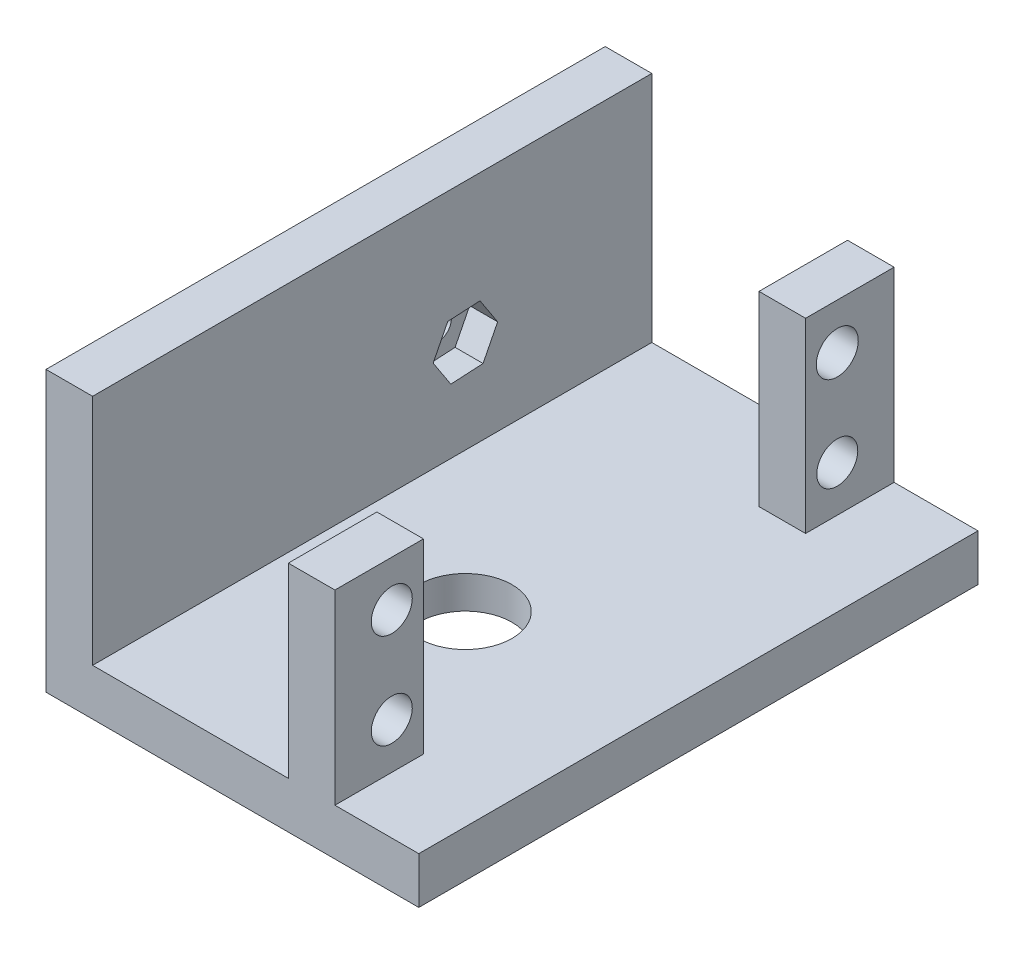
ISO-10303-21;
HEADER;
FILE_DESCRIPTION(('STEP AP214'),'2;1');
FILE_NAME('part.step','',(''),(''),'','','');
FILE_SCHEMA(('AUTOMOTIVE_DESIGN { 1 0 10303 214 1 1 1 1 }'));
ENDSEC;
DATA;
#1=APPLICATION_CONTEXT('core data for automotive mechanical design processes');
#2=APPLICATION_PROTOCOL_DEFINITION('international standard','automotive_design',2000,#1);
#3=PRODUCT_CONTEXT('',#1,'mechanical');
#4=PRODUCT('Part','Part','',(#3));
#5=PRODUCT_RELATED_PRODUCT_CATEGORY('part','',(#4));
#6=PRODUCT_DEFINITION_FORMATION('','',#4);
#7=PRODUCT_DEFINITION_CONTEXT('part definition',#1,'design');
#8=PRODUCT_DEFINITION('design','',#6,#7);
#9=PRODUCT_DEFINITION_SHAPE('','',#8);
#10=(LENGTH_UNIT() NAMED_UNIT(*) SI_UNIT(.MILLI.,.METRE.));
#11=(NAMED_UNIT(*) PLANE_ANGLE_UNIT() SI_UNIT($,.RADIAN.));
#12=(NAMED_UNIT(*) SI_UNIT($,.STERADIAN.) SOLID_ANGLE_UNIT());
#13=UNCERTAINTY_MEASURE_WITH_UNIT(LENGTH_MEASURE(1.E-05),#10,'distance_accuracy_value','');
#14=(GEOMETRIC_REPRESENTATION_CONTEXT(3) GLOBAL_UNCERTAINTY_ASSIGNED_CONTEXT((#13)) GLOBAL_UNIT_ASSIGNED_CONTEXT((#10,
#11,#12)) REPRESENTATION_CONTEXT('',''));
#15=CARTESIAN_POINT('',(0.,0.,0.));
#16=DIRECTION('',(0.,0.,1.));
#17=DIRECTION('',(1.,0.,0.));
#18=AXIS2_PLACEMENT_3D('',#15,#16,#17);
#19=CARTESIAN_POINT('',(10.,15.0000000000001,20.));
#20=DIRECTION('',(-1.,0.,0.));
#21=DIRECTION('',(0.,-1.,0.));
#22=AXIS2_PLACEMENT_3D('',#19,#20,#21);
#23=CYLINDRICAL_SURFACE('',#22,1.5);
#24=CARTESIAN_POINT('',(0.,15.0000000000001,20.));
#25=DIRECTION('',(-1.,0.,0.));
#26=DIRECTION('',(0.,-1.,0.));
#27=AXIS2_PLACEMENT_3D('',#24,#25,#26);
#28=CIRCLE('',#27,1.5);
#29=CARTESIAN_POINT('',(0.,13.5000000000001,20.));
#30=VERTEX_POINT('',#29);
#31=EDGE_CURVE('E227',#30,#30,#28,.T.);
#32=ORIENTED_EDGE('',*,*,#31,.T.);
#33=EDGE_LOOP('',(#32));
#34=FACE_BOUND('',#33,.T.);
#35=CARTESIAN_POINT('',(2.,15.0000000000001,20.));
#36=DIRECTION('',(1.,0.,0.));
#37=DIRECTION('',(0.,0.,-1.));
#38=AXIS2_PLACEMENT_3D('',#35,#36,#37);
#39=CIRCLE('',#38,1.5);
#40=CARTESIAN_POINT('',(2.,15.0000000000001,18.5));
#41=VERTEX_POINT('',#40);
#42=EDGE_CURVE('E37',#41,#41,#39,.F.);
#43=ORIENTED_EDGE('',*,*,#42,.F.);
#44=EDGE_LOOP('',(#43));
#45=FACE_BOUND('',#44,.T.);
#46=ADVANCED_FACE('F33',(#34,#45),#23,.F.);
#47=CARTESIAN_POINT('',(31.,25.,60.));
#48=DIRECTION('',(-1.,0.,0.));
#49=DIRECTION('',(0.,-1.,0.));
#50=AXIS2_PLACEMENT_3D('',#47,#48,#49);
#51=PLANE('',#50);
#52=CARTESIAN_POINT('',(31.,20.1,6.09999999999999));
#53=DIRECTION('',(1.,0.,0.));
#54=DIRECTION('',(0.,1.,0.));
#55=AXIS2_PLACEMENT_3D('',#52,#53,#54);
#56=CIRCLE('',#55,2.25352460703334);
#57=CARTESIAN_POINT('',(31.,22.3535246070334,6.09999999999999));
#58=VERTEX_POINT('',#57);
#59=EDGE_CURVE('E230',#58,#58,#56,.T.);
#60=ORIENTED_EDGE('',*,*,#59,.F.);
#61=EDGE_LOOP('',(#60));
#62=FACE_BOUND('',#61,.T.);
#63=CARTESIAN_POINT('',(31.,9.90000000000002,6.09999999999999));
#64=DIRECTION('',(1.,0.,0.));
#65=DIRECTION('',(0.,1.,0.));
#66=AXIS2_PLACEMENT_3D('',#63,#64,#65);
#67=CIRCLE('',#66,2.20000000000001);
#68=CARTESIAN_POINT('',(31.,12.1,6.09999999999999));
#69=VERTEX_POINT('',#68);
#70=EDGE_CURVE('E234',#69,#69,#67,.T.);
#71=ORIENTED_EDGE('',*,*,#70,.F.);
#72=EDGE_LOOP('',(#71));
#73=FACE_BOUND('',#72,.T.);
#74=DIRECTION('',(0.,0.,-1.));
#75=VECTOR('',#74,1.);
#76=CARTESIAN_POINT('',(31.,25.,60.));
#77=LINE('',#76,#75);
#78=CARTESIAN_POINT('',(31.,25.,9.5));
#79=VERTEX_POINT('',#78);
#80=CARTESIAN_POINT('',(31.,25.,0.));
#81=VERTEX_POINT('',#80);
#82=EDGE_CURVE('E339',#79,#81,#77,.T.);
#83=ORIENTED_EDGE('',*,*,#82,.F.);
#84=DIRECTION('',(0.,1.,0.));
#85=VECTOR('',#84,1.);
#86=CARTESIAN_POINT('',(31.,-36.3037528561268,9.5));
#87=LINE('',#86,#85);
#88=CARTESIAN_POINT('',(31.,5.,9.5));
#89=VERTEX_POINT('',#88);
#90=EDGE_CURVE('E271',#89,#79,#87,.T.);
#91=ORIENTED_EDGE('',*,*,#90,.F.);
#92=DIRECTION('',(0.,0.,-1.));
#93=VECTOR('',#92,1.);
#94=CARTESIAN_POINT('',(31.,5.,60.));
#95=LINE('',#94,#93);
#96=CARTESIAN_POINT('',(31.,5.,0.));
#97=VERTEX_POINT('',#96);
#98=EDGE_CURVE('E343',#89,#97,#95,.T.);
#99=ORIENTED_EDGE('',*,*,#98,.T.);
#100=DIRECTION('',(0.,1.,0.));
#101=VECTOR('',#100,1.);
#102=CARTESIAN_POINT('',(31.,25.,0.));
#103=LINE('',#102,#101);
#104=EDGE_CURVE('E309',#97,#81,#103,.T.);
#105=ORIENTED_EDGE('',*,*,#104,.T.);
#106=EDGE_LOOP('',(#83,#91,#99,#105));
#107=FACE_BOUND('',#106,.T.);
#108=ADVANCED_FACE('F378',(#62,#73,#107),#51,.F.);
#109=CARTESIAN_POINT('',(26.,25.,60.));
#110=DIRECTION('',(0.,-1.,0.));
#111=DIRECTION('',(0.,0.,-1.));
#112=AXIS2_PLACEMENT_3D('',#109,#110,#111);
#113=PLANE('',#112);
#114=DIRECTION('',(0.,0.,-1.));
#115=VECTOR('',#114,1.);
#116=CARTESIAN_POINT('',(26.,25.,60.));
#117=LINE('',#116,#115);
#118=CARTESIAN_POINT('',(26.,25.,9.5));
#119=VERTEX_POINT('',#118);
#120=CARTESIAN_POINT('',(26.,25.,0.));
#121=VERTEX_POINT('',#120);
#122=EDGE_CURVE('E335',#119,#121,#117,.T.);
#123=ORIENTED_EDGE('',*,*,#122,.F.);
#124=DIRECTION('',(-1.,0.,0.));
#125=VECTOR('',#124,1.);
#126=CARTESIAN_POINT('',(31.,25.,9.5));
#127=LINE('',#126,#125);
#128=EDGE_CURVE('E256',#79,#119,#127,.T.);
#129=ORIENTED_EDGE('',*,*,#128,.F.);
#130=ORIENTED_EDGE('',*,*,#82,.T.);
#131=DIRECTION('',(-1.,0.,0.));
#132=VECTOR('',#131,1.);
#133=CARTESIAN_POINT('',(26.,25.,0.));
#134=LINE('',#133,#132);
#135=EDGE_CURVE('E312',#81,#121,#134,.T.);
#136=ORIENTED_EDGE('',*,*,#135,.T.);
#137=EDGE_LOOP('',(#123,#129,#130,#136));
#138=FACE_BOUND('',#137,.T.);
#139=ADVANCED_FACE('F383',(#138),#113,.F.);
#140=CARTESIAN_POINT('',(26.,5.,60.));
#141=DIRECTION('',(1.,0.,0.));
#142=DIRECTION('',(0.,0.,-1.));
#143=AXIS2_PLACEMENT_3D('',#140,#141,#142);
#144=PLANE('',#143);
#145=CARTESIAN_POINT('',(26.,20.1,6.09999999999999));
#146=DIRECTION('',(1.,0.,0.));
#147=DIRECTION('',(0.,0.,-1.));
#148=AXIS2_PLACEMENT_3D('',#145,#146,#147);
#149=CIRCLE('',#148,2.25352460703334);
#150=CARTESIAN_POINT('',(26.,20.1,3.84647539296665));
#151=VERTEX_POINT('',#150);
#152=EDGE_CURVE('E233',#151,#151,#149,.T.);
#153=ORIENTED_EDGE('',*,*,#152,.T.);
#154=EDGE_LOOP('',(#153));
#155=FACE_BOUND('',#154,.T.);
#156=CARTESIAN_POINT('',(26.,9.90000000000002,6.09999999999999));
#157=DIRECTION('',(1.,0.,0.));
#158=DIRECTION('',(0.,0.,-1.));
#159=AXIS2_PLACEMENT_3D('',#156,#157,#158);
#160=CIRCLE('',#159,2.20000000000001);
#161=CARTESIAN_POINT('',(26.,9.90000000000002,3.89999999999999));
#162=VERTEX_POINT('',#161);
#163=EDGE_CURVE('E237',#162,#162,#160,.T.);
#164=ORIENTED_EDGE('',*,*,#163,.T.);
#165=EDGE_LOOP('',(#164));
#166=FACE_BOUND('',#165,.T.);
#167=DIRECTION('',(0.,0.,-1.));
#168=VECTOR('',#167,1.);
#169=CARTESIAN_POINT('',(26.,5.,60.));
#170=LINE('',#169,#168);
#171=CARTESIAN_POINT('',(26.,5.,9.5));
#172=VERTEX_POINT('',#171);
#173=CARTESIAN_POINT('',(26.,5.,0.));
#174=VERTEX_POINT('',#173);
#175=EDGE_CURVE('E331',#172,#174,#170,.T.);
#176=ORIENTED_EDGE('',*,*,#175,.F.);
#177=DIRECTION('',(0.,1.,0.));
#178=VECTOR('',#177,1.);
#179=CARTESIAN_POINT('',(26.,-36.3037528561268,9.5));
#180=LINE('',#179,#178);
#181=EDGE_CURVE('E263',#172,#119,#180,.T.);
#182=ORIENTED_EDGE('',*,*,#181,.T.);
#183=ORIENTED_EDGE('',*,*,#122,.T.);
#184=DIRECTION('',(0.,-1.,0.));
#185=VECTOR('',#184,1.);
#186=CARTESIAN_POINT('',(26.,5.,0.));
#187=LINE('',#186,#185);
#188=EDGE_CURVE('E315',#121,#174,#187,.T.);
#189=ORIENTED_EDGE('',*,*,#188,.T.);
#190=EDGE_LOOP('',(#176,#182,#183,#189));
#191=FACE_BOUND('',#190,.T.);
#192=ADVANCED_FACE('F360',(#155,#166,#191),#144,.F.);
#193=CARTESIAN_POINT('',(0.,30.,60.));
#194=DIRECTION('',(1.,0.,0.));
#195=DIRECTION('',(0.,1.,0.));
#196=AXIS2_PLACEMENT_3D('',#193,#194,#195);
#197=PLANE('',#196);
#198=ORIENTED_EDGE('',*,*,#31,.F.);
#199=EDGE_LOOP('',(#198));
#200=FACE_BOUND('',#199,.T.);
#201=DIRECTION('',(0.,-1.,0.));
#202=VECTOR('',#201,1.);
#203=CARTESIAN_POINT('',(0.,30.,0.));
#204=LINE('',#203,#202);
#205=CARTESIAN_POINT('',(0.,30.,0.));
#206=VERTEX_POINT('',#205);
#207=CARTESIAN_POINT('',(0.,0.,0.));
#208=VERTEX_POINT('',#207);
#209=EDGE_CURVE('E276',#206,#208,#204,.T.);
#210=ORIENTED_EDGE('',*,*,#209,.T.);
#211=DIRECTION('',(0.,0.,-1.));
#212=VECTOR('',#211,1.);
#213=CARTESIAN_POINT('',(0.,0.,60.));
#214=LINE('',#213,#212);
#215=CARTESIAN_POINT('',(0.,0.,60.));
#216=VERTEX_POINT('',#215);
#217=EDGE_CURVE('E11',#216,#208,#214,.T.);
#218=ORIENTED_EDGE('',*,*,#217,.F.);
#219=DIRECTION('',(0.,-1.,0.));
#220=VECTOR('',#219,1.);
#221=CARTESIAN_POINT('',(0.,30.,60.));
#222=LINE('',#221,#220);
#223=CARTESIAN_POINT('',(0.,30.,60.));
#224=VERTEX_POINT('',#223);
#225=EDGE_CURVE('E277',#224,#216,#222,.T.);
#226=ORIENTED_EDGE('',*,*,#225,.F.);
#227=DIRECTION('',(0.,0.,-1.));
#228=VECTOR('',#227,1.);
#229=CARTESIAN_POINT('',(0.,30.,60.));
#230=LINE('',#229,#228);
#231=EDGE_CURVE('E299',#224,#206,#230,.T.);
#232=ORIENTED_EDGE('',*,*,#231,.T.);
#233=EDGE_LOOP('',(#210,#218,#226,#232));
#234=FACE_BOUND('',#233,.T.);
#235=ADVANCED_FACE('F35',(#200,#234),#197,.F.);
#236=CARTESIAN_POINT('',(0.,0.,60.));
#237=DIRECTION('',(0.,1.,0.));
#238=DIRECTION('',(0.,0.,1.));
#239=AXIS2_PLACEMENT_3D('',#236,#237,#238);
#240=PLANE('',#239);
#241=CARTESIAN_POINT('',(20.,0.,35.));
#242=DIRECTION('',(0.,-1.,0.));
#243=DIRECTION('',(0.,0.,-1.));
#244=AXIS2_PLACEMENT_3D('',#241,#242,#243);
#245=CIRCLE('',#244,10.5);
#246=CARTESIAN_POINT('',(20.,0.,24.5));
#247=VERTEX_POINT('',#246);
#248=EDGE_CURVE('E252',#247,#247,#245,.T.);
#249=ORIENTED_EDGE('',*,*,#248,.F.);
#250=EDGE_LOOP('',(#249));
#251=FACE_BOUND('',#250,.T.);
#252=DIRECTION('',(1.,0.,0.));
#253=VECTOR('',#252,1.);
#254=CARTESIAN_POINT('',(0.,0.,0.));
#255=LINE('',#254,#253);
#256=CARTESIAN_POINT('',(40.,0.,0.));
#257=VERTEX_POINT('',#256);
#258=EDGE_CURVE('E302',#208,#257,#255,.T.);
#259=ORIENTED_EDGE('',*,*,#258,.T.);
#260=DIRECTION('',(0.,0.,-1.));
#261=VECTOR('',#260,1.);
#262=CARTESIAN_POINT('',(40.,0.,60.));
#263=LINE('',#262,#261);
#264=CARTESIAN_POINT('',(40.,0.,60.));
#265=VERTEX_POINT('',#264);
#266=EDGE_CURVE('E42',#265,#257,#263,.T.);
#267=ORIENTED_EDGE('',*,*,#266,.F.);
#268=DIRECTION('',(1.,0.,0.));
#269=VECTOR('',#268,1.);
#270=CARTESIAN_POINT('',(0.,0.,60.));
#271=LINE('',#270,#269);
#272=EDGE_CURVE('E280',#216,#265,#271,.T.);
#273=ORIENTED_EDGE('',*,*,#272,.F.);
#274=ORIENTED_EDGE('',*,*,#217,.T.);
#275=EDGE_LOOP('',(#259,#267,#273,#274));
#276=FACE_BOUND('',#275,.T.);
#277=ADVANCED_FACE('F464',(#251,#276),#240,.F.);
#278=CARTESIAN_POINT('',(40.,0.,60.));
#279=DIRECTION('',(-1.,0.,0.));
#280=DIRECTION('',(0.,0.,1.));
#281=AXIS2_PLACEMENT_3D('',#278,#279,#280);
#282=PLANE('',#281);
#283=DIRECTION('',(0.,1.,0.));
#284=VECTOR('',#283,1.);
#285=CARTESIAN_POINT('',(40.,0.,0.));
#286=LINE('',#285,#284);
#287=CARTESIAN_POINT('',(40.,5.,0.));
#288=VERTEX_POINT('',#287);
#289=EDGE_CURVE('E304',#257,#288,#286,.T.);
#290=ORIENTED_EDGE('',*,*,#289,.T.);
#291=DIRECTION('',(0.,0.,-1.));
#292=VECTOR('',#291,1.);
#293=CARTESIAN_POINT('',(40.,5.,60.));
#294=LINE('',#293,#292);
#295=CARTESIAN_POINT('',(40.,5.,60.));
#296=VERTEX_POINT('',#295);
#297=EDGE_CURVE('E347',#296,#288,#294,.T.);
#298=ORIENTED_EDGE('',*,*,#297,.F.);
#299=DIRECTION('',(0.,1.,0.));
#300=VECTOR('',#299,1.);
#301=CARTESIAN_POINT('',(40.,0.,60.));
#302=LINE('',#301,#300);
#303=EDGE_CURVE('E283',#265,#296,#302,.T.);
#304=ORIENTED_EDGE('',*,*,#303,.F.);
#305=ORIENTED_EDGE('',*,*,#266,.T.);
#306=EDGE_LOOP('',(#290,#298,#304,#305));
#307=FACE_BOUND('',#306,.T.);
#308=ADVANCED_FACE('F462',(#307),#282,.F.);
#309=CARTESIAN_POINT('',(31.,9.90000000000002,53.9));
#310=DIRECTION('',(1.,0.,0.));
#311=DIRECTION('',(0.,1.,0.));
#312=AXIS2_PLACEMENT_3D('',#309,#310,#311);
#313=CIRCLE('',#312,2.20000000000001);
#314=CARTESIAN_POINT('',(31.,12.1,53.9));
#315=VERTEX_POINT('',#314);
#316=EDGE_CURVE('E238',#315,#315,#313,.T.);
#317=ORIENTED_EDGE('',*,*,#316,.F.);
#318=EDGE_LOOP('',(#317));
#319=FACE_BOUND('',#318,.T.);
#320=CARTESIAN_POINT('',(31.,20.1,53.9));
#321=DIRECTION('',(1.,0.,0.));
#322=DIRECTION('',(0.,1.,0.));
#323=AXIS2_PLACEMENT_3D('',#320,#321,#322);
#324=CIRCLE('',#323,2.20000000000001);
#325=CARTESIAN_POINT('',(31.,22.3,53.9));
#326=VERTEX_POINT('',#325);
#327=EDGE_CURVE('E242',#326,#326,#324,.T.);
#328=ORIENTED_EDGE('',*,*,#327,.F.);
#329=EDGE_LOOP('',(#328));
#330=FACE_BOUND('',#329,.T.);
#331=CARTESIAN_POINT('',(31.,5.,60.));
#332=VERTEX_POINT('',#331);
#333=CARTESIAN_POINT('',(31.,5.,50.5));
#334=VERTEX_POINT('',#333);
#335=EDGE_CURVE('E344',#332,#334,#95,.T.);
#336=ORIENTED_EDGE('',*,*,#335,.T.);
#337=DIRECTION('',(0.,1.,0.));
#338=VECTOR('',#337,1.);
#339=CARTESIAN_POINT('',(31.,-36.3037528561268,50.5));
#340=LINE('',#339,#338);
#341=CARTESIAN_POINT('',(31.,25.,50.5));
#342=VERTEX_POINT('',#341);
#343=EDGE_CURVE('E267',#334,#342,#340,.T.);
#344=ORIENTED_EDGE('',*,*,#343,.T.);
#345=CARTESIAN_POINT('',(31.,25.,60.));
#346=VERTEX_POINT('',#345);
#347=EDGE_CURVE('E340',#346,#342,#77,.T.);
#348=ORIENTED_EDGE('',*,*,#347,.F.);
#349=DIRECTION('',(0.,1.,0.));
#350=VECTOR('',#349,1.);
#351=CARTESIAN_POINT('',(31.,25.,60.));
#352=LINE('',#351,#350);
#353=EDGE_CURVE('E287',#332,#346,#352,.T.);
#354=ORIENTED_EDGE('',*,*,#353,.F.);
#355=EDGE_LOOP('',(#336,#344,#348,#354));
#356=FACE_BOUND('',#355,.T.);
#357=ADVANCED_FACE('F386',(#319,#330,#356),#51,.F.);
#358=ORIENTED_EDGE('',*,*,#347,.T.);
#359=DIRECTION('',(1.,0.,0.));
#360=VECTOR('',#359,1.);
#361=CARTESIAN_POINT('',(31.,25.,50.5));
#362=LINE('',#361,#360);
#363=CARTESIAN_POINT('',(26.,25.,50.5));
#364=VERTEX_POINT('',#363);
#365=EDGE_CURVE('E259',#364,#342,#362,.T.);
#366=ORIENTED_EDGE('',*,*,#365,.F.);
#367=CARTESIAN_POINT('',(26.,25.,60.));
#368=VERTEX_POINT('',#367);
#369=EDGE_CURVE('E336',#368,#364,#117,.T.);
#370=ORIENTED_EDGE('',*,*,#369,.F.);
#371=DIRECTION('',(-1.,0.,0.));
#372=VECTOR('',#371,1.);
#373=CARTESIAN_POINT('',(26.,25.,60.));
#374=LINE('',#373,#372);
#375=EDGE_CURVE('E289',#346,#368,#374,.T.);
#376=ORIENTED_EDGE('',*,*,#375,.F.);
#377=EDGE_LOOP('',(#358,#366,#370,#376));
#378=FACE_BOUND('',#377,.T.);
#379=ADVANCED_FACE('F476',(#378),#113,.F.);
#380=CARTESIAN_POINT('',(26.,9.90000000000002,53.9));
#381=DIRECTION('',(1.,0.,0.));
#382=DIRECTION('',(0.,0.,-1.));
#383=AXIS2_PLACEMENT_3D('',#380,#381,#382);
#384=CIRCLE('',#383,2.20000000000001);
#385=CARTESIAN_POINT('',(26.,9.90000000000002,51.7));
#386=VERTEX_POINT('',#385);
#387=EDGE_CURVE('E241',#386,#386,#384,.T.);
#388=ORIENTED_EDGE('',*,*,#387,.T.);
#389=EDGE_LOOP('',(#388));
#390=FACE_BOUND('',#389,.T.);
#391=CARTESIAN_POINT('',(26.,20.1,53.9));
#392=DIRECTION('',(1.,0.,0.));
#393=DIRECTION('',(0.,0.,-1.));
#394=AXIS2_PLACEMENT_3D('',#391,#392,#393);
#395=CIRCLE('',#394,2.20000000000001);
#396=CARTESIAN_POINT('',(26.,20.1,51.7));
#397=VERTEX_POINT('',#396);
#398=EDGE_CURVE('E245',#397,#397,#395,.T.);
#399=ORIENTED_EDGE('',*,*,#398,.T.);
#400=EDGE_LOOP('',(#399));
#401=FACE_BOUND('',#400,.T.);
#402=ORIENTED_EDGE('',*,*,#369,.T.);
#403=DIRECTION('',(0.,1.,0.));
#404=VECTOR('',#403,1.);
#405=CARTESIAN_POINT('',(26.,-36.3037528561268,50.5));
#406=LINE('',#405,#404);
#407=CARTESIAN_POINT('',(26.,5.,50.5));
#408=VERTEX_POINT('',#407);
#409=EDGE_CURVE('E268',#408,#364,#406,.T.);
#410=ORIENTED_EDGE('',*,*,#409,.F.);
#411=CARTESIAN_POINT('',(26.,5.,60.));
#412=VERTEX_POINT('',#411);
#413=EDGE_CURVE('E332',#412,#408,#170,.T.);
#414=ORIENTED_EDGE('',*,*,#413,.F.);
#415=DIRECTION('',(0.,-1.,0.));
#416=VECTOR('',#415,1.);
#417=CARTESIAN_POINT('',(26.,5.,60.));
#418=LINE('',#417,#416);
#419=EDGE_CURVE('E291',#368,#412,#418,.T.);
#420=ORIENTED_EDGE('',*,*,#419,.F.);
#421=EDGE_LOOP('',(#402,#410,#414,#420));
#422=FACE_BOUND('',#421,.T.);
#423=ADVANCED_FACE('F480',(#390,#401,#422),#144,.F.);
#424=CARTESIAN_POINT('',(26.,5.,60.));
#425=DIRECTION('',(0.,-1.,0.));
#426=DIRECTION('',(1.,0.,0.));
#427=AXIS2_PLACEMENT_3D('',#424,#425,#426);
#428=PLANE('',#427);
#429=CARTESIAN_POINT('',(20.,5.,35.));
#430=DIRECTION('',(0.,-1.,0.));
#431=DIRECTION('',(1.,0.,0.));
#432=AXIS2_PLACEMENT_3D('',#429,#430,#431);
#433=CIRCLE('',#432,5.);
#434=CARTESIAN_POINT('',(25.,5.,35.));
#435=VERTEX_POINT('',#434);
#436=EDGE_CURVE('E249',#435,#435,#433,.T.);
#437=ORIENTED_EDGE('',*,*,#436,.T.);
#438=EDGE_LOOP('',(#437));
#439=FACE_BOUND('',#438,.T.);
#440=DIRECTION('',(-1.,0.,0.));
#441=VECTOR('',#440,1.);
#442=CARTESIAN_POINT('',(26.,5.,0.));
#443=LINE('',#442,#441);
#444=CARTESIAN_POINT('',(5.,4.99999999999999,0.));
#445=VERTEX_POINT('',#444);
#446=EDGE_CURVE('E318',#174,#445,#443,.T.);
#447=ORIENTED_EDGE('',*,*,#446,.T.);
#448=DIRECTION('',(0.,0.,-1.));
#449=VECTOR('',#448,1.);
#450=CARTESIAN_POINT('',(5.,4.99999999999999,60.));
#451=LINE('',#450,#449);
#452=CARTESIAN_POINT('',(5.,4.99999999999999,60.));
#453=VERTEX_POINT('',#452);
#454=EDGE_CURVE('E328',#453,#445,#451,.T.);
#455=ORIENTED_EDGE('',*,*,#454,.F.);
#456=DIRECTION('',(-1.,0.,0.));
#457=VECTOR('',#456,1.);
#458=CARTESIAN_POINT('',(26.,5.,60.));
#459=LINE('',#458,#457);
#460=EDGE_CURVE('E293',#412,#453,#459,.T.);
#461=ORIENTED_EDGE('',*,*,#460,.F.);
#462=ORIENTED_EDGE('',*,*,#413,.T.);
#463=DIRECTION('',(1.,0.,0.));
#464=VECTOR('',#463,1.);
#465=CARTESIAN_POINT('',(31.,5.,50.5));
#466=LINE('',#465,#464);
#467=EDGE_CURVE('E264',#408,#334,#466,.T.);
#468=ORIENTED_EDGE('',*,*,#467,.T.);
#469=ORIENTED_EDGE('',*,*,#335,.F.);
#470=DIRECTION('',(-1.,0.,0.));
#471=VECTOR('',#470,1.);
#472=CARTESIAN_POINT('',(40.,5.,60.));
#473=LINE('',#472,#471);
#474=EDGE_CURVE('E285',#296,#332,#473,.T.);
#475=ORIENTED_EDGE('',*,*,#474,.F.);
#476=ORIENTED_EDGE('',*,*,#297,.T.);
#477=DIRECTION('',(-1.,0.,0.));
#478=VECTOR('',#477,1.);
#479=CARTESIAN_POINT('',(40.,5.,0.));
#480=LINE('',#479,#478);
#481=EDGE_CURVE('E306',#288,#97,#480,.T.);
#482=ORIENTED_EDGE('',*,*,#481,.T.);
#483=ORIENTED_EDGE('',*,*,#98,.F.);
#484=DIRECTION('',(-1.,0.,0.));
#485=VECTOR('',#484,1.);
#486=CARTESIAN_POINT('',(31.,5.,9.5));
#487=LINE('',#486,#485);
#488=EDGE_CURVE('E58',#89,#172,#487,.T.);
#489=ORIENTED_EDGE('',*,*,#488,.T.);
#490=ORIENTED_EDGE('',*,*,#175,.T.);
#491=EDGE_LOOP('',(#447,#455,#461,#462,#468,#469,#475,#476,#482,#483,#489,#490));
#492=FACE_BOUND('',#491,.T.);
#493=ADVANCED_FACE('F421',(#439,#492),#428,.F.);
#494=CARTESIAN_POINT('',(5.,4.99999999999999,60.));
#495=DIRECTION('',(-1.,0.,0.));
#496=DIRECTION('',(0.,-1.,0.));
#497=AXIS2_PLACEMENT_3D('',#494,#495,#496);
#498=PLANE('',#497);
#499=DIRECTION('',(0.,-0.0551356736831265,0.998478871828297));
#500=VECTOR('',#499,1.);
#501=CARTESIAN_POINT('',(5.,18.0909344036137,18.4359908847587));
#502=LINE('',#501,#500);
#503=CARTESIAN_POINT('',(5.,18.0909344036137,18.4359908847587));
#504=VERTEX_POINT('',#503);
#505=CARTESIAN_POINT('',(5.,17.8999388273562,21.89482315734));
#506=VERTEX_POINT('',#505);
#507=EDGE_CURVE('E208',#504,#506,#502,.T.);
#508=ORIENTED_EDGE('',*,*,#507,.F.);
#509=DIRECTION('',(0.,0.837140231303768,0.546988329978505));
#510=VECTOR('',#509,1.);
#511=CARTESIAN_POINT('',(5.,15.1909955762575,16.5411677274186));
#512=LINE('',#511,#510);
#513=CARTESIAN_POINT('',(5.,15.1909955762575,16.5411677274186));
#514=VERTEX_POINT('',#513);
#515=EDGE_CURVE('E50',#514,#504,#512,.T.);
#516=ORIENTED_EDGE('',*,*,#515,.F.);
#517=DIRECTION('',(0.,0.892275904986895,-0.451490541849791));
#518=VECTOR('',#517,1.);
#519=CARTESIAN_POINT('',(5.,12.1000611726439,18.1051768426599));
#520=LINE('',#519,#518);
#521=CARTESIAN_POINT('',(5.,12.1000611726439,18.1051768426599));
#522=VERTEX_POINT('',#521);
#523=EDGE_CURVE('E194',#522,#514,#520,.T.);
#524=ORIENTED_EDGE('',*,*,#523,.F.);
#525=DIRECTION('',(0.,0.0551356736831265,-0.998478871828297));
#526=VECTOR('',#525,1.);
#527=CARTESIAN_POINT('',(5.,11.9090655963865,21.5640091152412));
#528=LINE('',#527,#526);
#529=CARTESIAN_POINT('',(5.,11.9090655963865,21.5640091152412));
#530=VERTEX_POINT('',#529);
#531=EDGE_CURVE('E197',#530,#522,#528,.T.);
#532=ORIENTED_EDGE('',*,*,#531,.F.);
#533=DIRECTION('',(0.,-0.837140231303768,-0.546988329978506));
#534=VECTOR('',#533,1.);
#535=CARTESIAN_POINT('',(5.,14.8090044237426,23.4588322725813));
#536=LINE('',#535,#534);
#537=CARTESIAN_POINT('',(5.,14.8090044237426,23.4588322725813));
#538=VERTEX_POINT('',#537);
#539=EDGE_CURVE('E213',#538,#530,#536,.T.);
#540=ORIENTED_EDGE('',*,*,#539,.F.);
#541=DIRECTION('',(0.,-0.892275904986895,0.451490541849792));
#542=VECTOR('',#541,1.);
#543=CARTESIAN_POINT('',(5.,17.8999388273562,21.89482315734));
#544=LINE('',#543,#542);
#545=EDGE_CURVE('E210',#506,#538,#544,.T.);
#546=ORIENTED_EDGE('',*,*,#545,.F.);
#547=EDGE_LOOP('',(#508,#516,#524,#532,#540,#546));
#548=FACE_BOUND('',#547,.T.);
#549=DIRECTION('',(0.,1.,0.));
#550=VECTOR('',#549,1.);
#551=CARTESIAN_POINT('',(5.,4.99999999999999,0.));
#552=LINE('',#551,#550);
#553=CARTESIAN_POINT('',(5.,30.,0.));
#554=VERTEX_POINT('',#553);
#555=EDGE_CURVE('E320',#445,#554,#552,.T.);
#556=ORIENTED_EDGE('',*,*,#555,.T.);
#557=DIRECTION('',(0.,0.,-1.));
#558=VECTOR('',#557,1.);
#559=CARTESIAN_POINT('',(5.,30.,60.));
#560=LINE('',#559,#558);
#561=CARTESIAN_POINT('',(5.,30.,60.));
#562=VERTEX_POINT('',#561);
#563=EDGE_CURVE('E325',#562,#554,#560,.T.);
#564=ORIENTED_EDGE('',*,*,#563,.F.);
#565=DIRECTION('',(0.,1.,0.));
#566=VECTOR('',#565,1.);
#567=CARTESIAN_POINT('',(5.,4.99999999999999,60.));
#568=LINE('',#567,#566);
#569=EDGE_CURVE('E295',#453,#562,#568,.T.);
#570=ORIENTED_EDGE('',*,*,#569,.F.);
#571=ORIENTED_EDGE('',*,*,#454,.T.);
#572=EDGE_LOOP('',(#556,#564,#570,#571));
#573=FACE_BOUND('',#572,.T.);
#574=ADVANCED_FACE('F413',(#548,#573),#498,.F.);
#575=CARTESIAN_POINT('',(5.,30.,60.));
#576=DIRECTION('',(0.,-1.,0.));
#577=DIRECTION('',(0.,0.,-1.));
#578=AXIS2_PLACEMENT_3D('',#575,#576,#577);
#579=PLANE('',#578);
#580=DIRECTION('',(-1.,0.,0.));
#581=VECTOR('',#580,1.);
#582=CARTESIAN_POINT('',(5.,30.,0.));
#583=LINE('',#582,#581);
#584=EDGE_CURVE('E281',#554,#206,#583,.T.);
#585=ORIENTED_EDGE('',*,*,#584,.T.);
#586=ORIENTED_EDGE('',*,*,#231,.F.);
#587=DIRECTION('',(-1.,0.,0.));
#588=VECTOR('',#587,1.);
#589=CARTESIAN_POINT('',(5.,30.,60.));
#590=LINE('',#589,#588);
#591=EDGE_CURVE('E297',#562,#224,#590,.T.);
#592=ORIENTED_EDGE('',*,*,#591,.F.);
#593=ORIENTED_EDGE('',*,*,#563,.T.);
#594=EDGE_LOOP('',(#585,#586,#592,#593));
#595=FACE_BOUND('',#594,.T.);
#596=ADVANCED_FACE('F420',(#595),#579,.F.);
#597=CARTESIAN_POINT('',(0.,0.,60.));
#598=DIRECTION('',(0.,0.,1.));
#599=DIRECTION('',(1.,0.,0.));
#600=AXIS2_PLACEMENT_3D('',#597,#598,#599);
#601=PLANE('',#600);
#602=ORIENTED_EDGE('',*,*,#225,.T.);
#603=ORIENTED_EDGE('',*,*,#272,.T.);
#604=ORIENTED_EDGE('',*,*,#303,.T.);
#605=ORIENTED_EDGE('',*,*,#474,.T.);
#606=ORIENTED_EDGE('',*,*,#353,.T.);
#607=ORIENTED_EDGE('',*,*,#375,.T.);
#608=ORIENTED_EDGE('',*,*,#419,.T.);
#609=ORIENTED_EDGE('',*,*,#460,.T.);
#610=ORIENTED_EDGE('',*,*,#569,.T.);
#611=ORIENTED_EDGE('',*,*,#591,.T.);
#612=EDGE_LOOP('',(#602,#603,#604,#605,#606,#607,#608,#609,#610,#611));
#613=FACE_BOUND('',#612,.T.);
#614=ADVANCED_FACE('F440',(#613),#601,.T.);
#615=CARTESIAN_POINT('',(0.,0.,0.));
#616=DIRECTION('',(0.,0.,1.));
#617=DIRECTION('',(1.,0.,0.));
#618=AXIS2_PLACEMENT_3D('',#615,#616,#617);
#619=PLANE('',#618);
#620=ORIENTED_EDGE('',*,*,#209,.F.);
#621=ORIENTED_EDGE('',*,*,#584,.F.);
#622=ORIENTED_EDGE('',*,*,#555,.F.);
#623=ORIENTED_EDGE('',*,*,#446,.F.);
#624=ORIENTED_EDGE('',*,*,#188,.F.);
#625=ORIENTED_EDGE('',*,*,#135,.F.);
#626=ORIENTED_EDGE('',*,*,#104,.F.);
#627=ORIENTED_EDGE('',*,*,#481,.F.);
#628=ORIENTED_EDGE('',*,*,#289,.F.);
#629=ORIENTED_EDGE('',*,*,#258,.F.);
#630=EDGE_LOOP('',(#620,#621,#622,#623,#624,#625,#626,#627,#628,#629));
#631=FACE_BOUND('',#630,.T.);
#632=ADVANCED_FACE('F434',(#631),#619,.F.);
#633=CARTESIAN_POINT('',(31.,-36.3037528561268,9.5));
#634=DIRECTION('',(0.,0.,-1.));
#635=DIRECTION('',(-1.,0.,0.));
#636=AXIS2_PLACEMENT_3D('',#633,#634,#635);
#637=PLANE('',#636);
#638=ORIENTED_EDGE('',*,*,#90,.T.);
#639=ORIENTED_EDGE('',*,*,#128,.T.);
#640=ORIENTED_EDGE('',*,*,#181,.F.);
#641=ORIENTED_EDGE('',*,*,#488,.F.);
#642=EDGE_LOOP('',(#638,#639,#640,#641));
#643=FACE_BOUND('',#642,.T.);
#644=ADVANCED_FACE('F492',(#643),#637,.F.);
#645=CARTESIAN_POINT('',(31.,-36.3037528561268,50.5));
#646=DIRECTION('',(0.,0.,1.));
#647=DIRECTION('',(1.,0.,0.));
#648=AXIS2_PLACEMENT_3D('',#645,#646,#647);
#649=PLANE('',#648);
#650=ORIENTED_EDGE('',*,*,#409,.T.);
#651=ORIENTED_EDGE('',*,*,#365,.T.);
#652=ORIENTED_EDGE('',*,*,#343,.F.);
#653=ORIENTED_EDGE('',*,*,#467,.F.);
#654=EDGE_LOOP('',(#650,#651,#652,#653));
#655=FACE_BOUND('',#654,.T.);
#656=ADVANCED_FACE('F497',(#655),#649,.F.);
#657=CARTESIAN_POINT('',(20.,1.5,35.));
#658=DIRECTION('',(0.,-1.,0.));
#659=DIRECTION('',(0.,0.,-1.));
#660=AXIS2_PLACEMENT_3D('',#657,#658,#659);
#661=CYLINDRICAL_SURFACE('',#660,10.5);
#662=CARTESIAN_POINT('',(20.,1.5,35.));
#663=DIRECTION('',(0.,-1.,0.));
#664=DIRECTION('',(0.,0.,-1.));
#665=AXIS2_PLACEMENT_3D('',#662,#663,#664);
#666=CIRCLE('',#665,10.5);
#667=CARTESIAN_POINT('',(20.,1.5,24.5));
#668=VERTEX_POINT('',#667);
#669=EDGE_CURVE('E253',#668,#668,#666,.T.);
#670=ORIENTED_EDGE('',*,*,#669,.F.);
#671=EDGE_LOOP('',(#670));
#672=FACE_BOUND('',#671,.T.);
#673=ORIENTED_EDGE('',*,*,#248,.T.);
#674=EDGE_LOOP('',(#673));
#675=FACE_BOUND('',#674,.T.);
#676=ADVANCED_FACE('F501',(#672,#675),#661,.F.);
#677=CARTESIAN_POINT('',(20.,1.5,35.));
#678=DIRECTION('',(0.,-1.,0.));
#679=DIRECTION('',(0.,0.,-1.));
#680=AXIS2_PLACEMENT_3D('',#677,#678,#679);
#681=PLANE('',#680);
#682=CARTESIAN_POINT('',(20.,1.5,35.));
#683=DIRECTION('',(0.,-1.,0.));
#684=DIRECTION('',(0.,0.,-1.));
#685=AXIS2_PLACEMENT_3D('',#682,#683,#684);
#686=CIRCLE('',#685,5.);
#687=CARTESIAN_POINT('',(20.,1.5,30.));
#688=VERTEX_POINT('',#687);
#689=EDGE_CURVE('E246',#688,#688,#686,.T.);
#690=ORIENTED_EDGE('',*,*,#689,.F.);
#691=EDGE_LOOP('',(#690));
#692=FACE_BOUND('',#691,.T.);
#693=ORIENTED_EDGE('',*,*,#669,.T.);
#694=EDGE_LOOP('',(#693));
#695=FACE_BOUND('',#694,.T.);
#696=ADVANCED_FACE('F505',(#692,#695),#681,.T.);
#697=CARTESIAN_POINT('',(20.,53.,35.));
#698=DIRECTION('',(0.,-1.,0.));
#699=DIRECTION('',(0.,0.,-1.));
#700=AXIS2_PLACEMENT_3D('',#697,#698,#699);
#701=CYLINDRICAL_SURFACE('',#700,5.);
#702=ORIENTED_EDGE('',*,*,#689,.T.);
#703=EDGE_LOOP('',(#702));
#704=FACE_BOUND('',#703,.T.);
#705=ORIENTED_EDGE('',*,*,#436,.F.);
#706=EDGE_LOOP('',(#705));
#707=FACE_BOUND('',#706,.T.);
#708=ADVANCED_FACE('F509',(#704,#707),#701,.F.);
#709=CARTESIAN_POINT('',(21.,20.1,53.9));
#710=DIRECTION('',(1.,0.,0.));
#711=DIRECTION('',(0.,1.,0.));
#712=AXIS2_PLACEMENT_3D('',#709,#710,#711);
#713=CYLINDRICAL_SURFACE('',#712,2.20000000000001);
#714=ORIENTED_EDGE('',*,*,#327,.T.);
#715=EDGE_LOOP('',(#714));
#716=FACE_BOUND('',#715,.T.);
#717=ORIENTED_EDGE('',*,*,#398,.F.);
#718=EDGE_LOOP('',(#717));
#719=FACE_BOUND('',#718,.T.);
#720=ADVANCED_FACE('F513',(#716,#719),#713,.F.);
#721=CARTESIAN_POINT('',(21.,9.90000000000002,53.9));
#722=DIRECTION('',(1.,0.,0.));
#723=DIRECTION('',(0.,1.,0.));
#724=AXIS2_PLACEMENT_3D('',#721,#722,#723);
#725=CYLINDRICAL_SURFACE('',#724,2.20000000000001);
#726=ORIENTED_EDGE('',*,*,#316,.T.);
#727=EDGE_LOOP('',(#726));
#728=FACE_BOUND('',#727,.T.);
#729=ORIENTED_EDGE('',*,*,#387,.F.);
#730=EDGE_LOOP('',(#729));
#731=FACE_BOUND('',#730,.T.);
#732=ADVANCED_FACE('F373',(#728,#731),#725,.F.);
#733=CARTESIAN_POINT('',(21.,9.90000000000002,6.09999999999999));
#734=DIRECTION('',(1.,0.,0.));
#735=DIRECTION('',(0.,1.,0.));
#736=AXIS2_PLACEMENT_3D('',#733,#734,#735);
#737=CYLINDRICAL_SURFACE('',#736,2.20000000000001);
#738=ORIENTED_EDGE('',*,*,#70,.T.);
#739=EDGE_LOOP('',(#738));
#740=FACE_BOUND('',#739,.T.);
#741=ORIENTED_EDGE('',*,*,#163,.F.);
#742=EDGE_LOOP('',(#741));
#743=FACE_BOUND('',#742,.T.);
#744=ADVANCED_FACE('F365',(#740,#743),#737,.F.);
#745=CARTESIAN_POINT('',(21.,20.1,6.09999999999999));
#746=DIRECTION('',(1.,0.,0.));
#747=DIRECTION('',(0.,1.,0.));
#748=AXIS2_PLACEMENT_3D('',#745,#746,#747);
#749=CYLINDRICAL_SURFACE('',#748,2.25352460703334);
#750=ORIENTED_EDGE('',*,*,#59,.T.);
#751=EDGE_LOOP('',(#750));
#752=FACE_BOUND('',#751,.T.);
#753=ORIENTED_EDGE('',*,*,#152,.F.);
#754=EDGE_LOOP('',(#753));
#755=FACE_BOUND('',#754,.T.);
#756=ADVANCED_FACE('F363',(#752,#755),#749,.F.);
#757=CARTESIAN_POINT('',(2.,0.,0.));
#758=DIRECTION('',(1.,0.,0.));
#759=DIRECTION('',(0.,0.,-1.));
#760=AXIS2_PLACEMENT_3D('',#757,#758,#759);
#761=PLANE('',#760);
#762=DIRECTION('',(0.,0.837140231303768,0.546988329978505));
#763=VECTOR('',#762,1.);
#764=CARTESIAN_POINT('',(2.,15.1909955762575,16.5411677274186));
#765=LINE('',#764,#763);
#766=CARTESIAN_POINT('',(2.,15.1909955762575,16.5411677274186));
#767=VERTEX_POINT('',#766);
#768=CARTESIAN_POINT('',(2.,18.0909344036137,18.4359908847587));
#769=VERTEX_POINT('',#768);
#770=EDGE_CURVE('E174',#767,#769,#765,.T.);
#771=ORIENTED_EDGE('',*,*,#770,.T.);
#772=DIRECTION('',(0.,-0.0551356736831265,0.998478871828297));
#773=VECTOR('',#772,1.);
#774=CARTESIAN_POINT('',(2.,18.0909344036137,18.4359908847587));
#775=LINE('',#774,#773);
#776=CARTESIAN_POINT('',(2.,17.8999388273562,21.89482315734));
#777=VERTEX_POINT('',#776);
#778=EDGE_CURVE('E183',#769,#777,#775,.T.);
#779=ORIENTED_EDGE('',*,*,#778,.T.);
#780=DIRECTION('',(0.,-0.892275904986895,0.451490541849792));
#781=VECTOR('',#780,1.);
#782=CARTESIAN_POINT('',(2.,17.8999388273562,21.89482315734));
#783=LINE('',#782,#781);
#784=CARTESIAN_POINT('',(2.,14.8090044237426,23.4588322725813));
#785=VERTEX_POINT('',#784);
#786=EDGE_CURVE('E188',#777,#785,#783,.T.);
#787=ORIENTED_EDGE('',*,*,#786,.T.);
#788=DIRECTION('',(0.,-0.837140231303768,-0.546988329978506));
#789=VECTOR('',#788,1.);
#790=CARTESIAN_POINT('',(2.,14.8090044237426,23.4588322725813));
#791=LINE('',#790,#789);
#792=CARTESIAN_POINT('',(2.,11.9090655963865,21.5640091152412));
#793=VERTEX_POINT('',#792);
#794=EDGE_CURVE('E201',#785,#793,#791,.T.);
#795=ORIENTED_EDGE('',*,*,#794,.T.);
#796=DIRECTION('',(0.,0.0551356736831265,-0.998478871828297));
#797=VECTOR('',#796,1.);
#798=CARTESIAN_POINT('',(2.,11.9090655963865,21.5640091152412));
#799=LINE('',#798,#797);
#800=CARTESIAN_POINT('',(2.,12.1000611726439,18.1051768426599));
#801=VERTEX_POINT('',#800);
#802=EDGE_CURVE('E204',#793,#801,#799,.T.);
#803=ORIENTED_EDGE('',*,*,#802,.T.);
#804=DIRECTION('',(0.,0.892275904986895,-0.451490541849791));
#805=VECTOR('',#804,1.);
#806=CARTESIAN_POINT('',(2.,12.1000611726439,18.1051768426599));
#807=LINE('',#806,#805);
#808=EDGE_CURVE('E180',#801,#767,#807,.T.);
#809=ORIENTED_EDGE('',*,*,#808,.T.);
#810=EDGE_LOOP('',(#771,#779,#787,#795,#803,#809));
#811=FACE_BOUND('',#810,.T.);
#812=ORIENTED_EDGE('',*,*,#42,.T.);
#813=EDGE_LOOP('',(#812));
#814=FACE_BOUND('',#813,.T.);
#815=ADVANCED_FACE('F190',(#811,#814),#761,.T.);
#816=CARTESIAN_POINT('',(2.,15.1909955762575,16.5411677274186));
#817=DIRECTION('',(0.,0.546988329978505,-0.837140231303768));
#818=DIRECTION('',(0.,0.837140231303768,0.546988329978505));
#819=AXIS2_PLACEMENT_3D('',#816,#817,#818);
#820=PLANE('',#819);
#821=ORIENTED_EDGE('',*,*,#515,.T.);
#822=DIRECTION('',(1.,0.,0.));
#823=VECTOR('',#822,1.);
#824=CARTESIAN_POINT('',(2.,18.0909344036137,18.4359908847587));
#825=LINE('',#824,#823);
#826=EDGE_CURVE('E170',#769,#504,#825,.T.);
#827=ORIENTED_EDGE('',*,*,#826,.F.);
#828=ORIENTED_EDGE('',*,*,#770,.F.);
#829=DIRECTION('',(1.,0.,0.));
#830=VECTOR('',#829,1.);
#831=CARTESIAN_POINT('',(2.,15.1909955762575,16.5411677274186));
#832=LINE('',#831,#830);
#833=EDGE_CURVE('E218',#767,#514,#832,.T.);
#834=ORIENTED_EDGE('',*,*,#833,.T.);
#835=EDGE_LOOP('',(#821,#827,#828,#834));
#836=FACE_BOUND('',#835,.T.);
#837=ADVANCED_FACE('F172',(#836),#820,.F.);
#838=CARTESIAN_POINT('',(2.,12.1000611726439,18.1051768426599));
#839=DIRECTION('',(0.,-0.45149054184979,-0.892275904986895));
#840=DIRECTION('',(0.,0.892275904986895,-0.451490541849791));
#841=AXIS2_PLACEMENT_3D('',#838,#839,#840);
#842=PLANE('',#841);
#843=ORIENTED_EDGE('',*,*,#523,.T.);
#844=ORIENTED_EDGE('',*,*,#833,.F.);
#845=ORIENTED_EDGE('',*,*,#808,.F.);
#846=DIRECTION('',(1.,0.,0.));
#847=VECTOR('',#846,1.);
#848=CARTESIAN_POINT('',(2.,12.1000611726439,18.1051768426599));
#849=LINE('',#848,#847);
#850=EDGE_CURVE('E220',#801,#522,#849,.T.);
#851=ORIENTED_EDGE('',*,*,#850,.T.);
#852=EDGE_LOOP('',(#843,#844,#845,#851));
#853=FACE_BOUND('',#852,.T.);
#854=ADVANCED_FACE('F391',(#853),#842,.F.);
#855=CARTESIAN_POINT('',(2.,11.9090655963865,21.5640091152412));
#856=DIRECTION('',(0.,-0.998478871828296,-0.0551356736831265));
#857=DIRECTION('',(0.,0.0551356736831265,-0.998478871828297));
#858=AXIS2_PLACEMENT_3D('',#855,#856,#857);
#859=PLANE('',#858);
#860=ORIENTED_EDGE('',*,*,#531,.T.);
#861=ORIENTED_EDGE('',*,*,#850,.F.);
#862=ORIENTED_EDGE('',*,*,#802,.F.);
#863=DIRECTION('',(1.,0.,0.));
#864=VECTOR('',#863,1.);
#865=CARTESIAN_POINT('',(2.,11.9090655963865,21.5640091152412));
#866=LINE('',#865,#864);
#867=EDGE_CURVE('E222',#793,#530,#866,.T.);
#868=ORIENTED_EDGE('',*,*,#867,.T.);
#869=EDGE_LOOP('',(#860,#861,#862,#868));
#870=FACE_BOUND('',#869,.T.);
#871=ADVANCED_FACE('F401',(#870),#859,.F.);
#872=CARTESIAN_POINT('',(2.,14.8090044237426,23.4588322725813));
#873=DIRECTION('',(0.,-0.546988329978506,0.837140231303768));
#874=DIRECTION('',(0.,-0.837140231303768,-0.546988329978506));
#875=AXIS2_PLACEMENT_3D('',#872,#873,#874);
#876=PLANE('',#875);
#877=ORIENTED_EDGE('',*,*,#539,.T.);
#878=ORIENTED_EDGE('',*,*,#867,.F.);
#879=ORIENTED_EDGE('',*,*,#794,.F.);
#880=DIRECTION('',(1.,0.,0.));
#881=VECTOR('',#880,1.);
#882=CARTESIAN_POINT('',(2.,14.8090044237426,23.4588322725813));
#883=LINE('',#882,#881);
#884=EDGE_CURVE('E224',#785,#538,#883,.T.);
#885=ORIENTED_EDGE('',*,*,#884,.T.);
#886=EDGE_LOOP('',(#877,#878,#879,#885));
#887=FACE_BOUND('',#886,.T.);
#888=ADVANCED_FACE('F397',(#887),#876,.F.);
#889=CARTESIAN_POINT('',(2.,17.8999388273562,21.89482315734));
#890=DIRECTION('',(0.,0.451490541849791,0.892275904986894));
#891=DIRECTION('',(0.,-0.892275904986895,0.451490541849792));
#892=AXIS2_PLACEMENT_3D('',#889,#890,#891);
#893=PLANE('',#892);
#894=ORIENTED_EDGE('',*,*,#545,.T.);
#895=ORIENTED_EDGE('',*,*,#884,.F.);
#896=ORIENTED_EDGE('',*,*,#786,.F.);
#897=DIRECTION('',(1.,0.,0.));
#898=VECTOR('',#897,1.);
#899=CARTESIAN_POINT('',(2.,17.8999388273562,21.89482315734));
#900=LINE('',#899,#898);
#901=EDGE_CURVE('E179',#777,#506,#900,.T.);
#902=ORIENTED_EDGE('',*,*,#901,.T.);
#903=EDGE_LOOP('',(#894,#895,#896,#902));
#904=FACE_BOUND('',#903,.T.);
#905=ADVANCED_FACE('F394',(#904),#893,.F.);
#906=CARTESIAN_POINT('',(2.,18.0909344036137,18.4359908847587));
#907=DIRECTION('',(0.,0.998478871828296,0.0551356736831265));
#908=DIRECTION('',(0.,-0.0551356736831265,0.998478871828297));
#909=AXIS2_PLACEMENT_3D('',#906,#907,#908);
#910=PLANE('',#909);
#911=ORIENTED_EDGE('',*,*,#507,.T.);
#912=ORIENTED_EDGE('',*,*,#901,.F.);
#913=ORIENTED_EDGE('',*,*,#778,.F.);
#914=ORIENTED_EDGE('',*,*,#826,.T.);
#915=EDGE_LOOP('',(#911,#912,#913,#914));
#916=FACE_BOUND('',#915,.T.);
#917=ADVANCED_FACE('F184',(#916),#910,.F.);
#918=CLOSED_SHELL('',(#46,#108,#139,#192,#235,#277,#308,#357,#379,#423,#493,#574,#596,#614,#632,
#644,#656,#676,#696,#708,#720,#732,#744,#756,#815,#837,#854,#871,#888,#905,#917));
#919=MANIFOLD_SOLID_BREP('B2',#918);
#920=ADVANCED_BREP_SHAPE_REPRESENTATION('',(#18,#919),#14);
#921=SHAPE_DEFINITION_REPRESENTATION(#9,#920);
ENDSEC;
END-ISO-10303-21;
